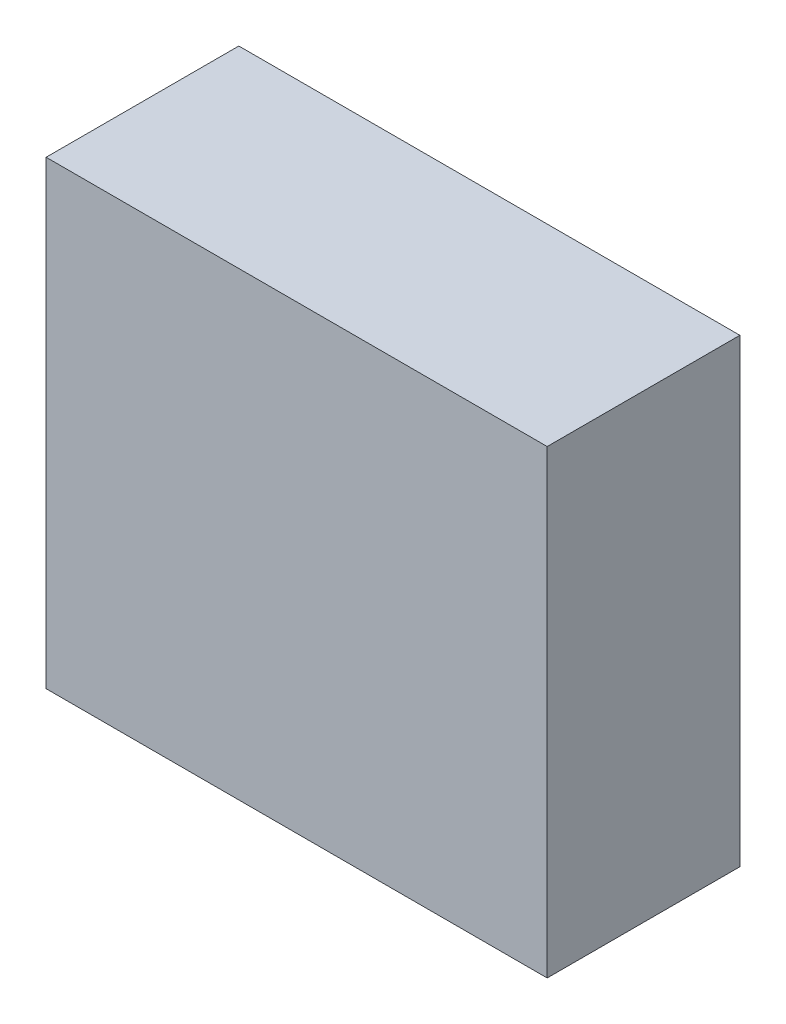
ISO-10303-21;
HEADER;
FILE_DESCRIPTION(('STEP AP214'),'2;1');
FILE_NAME('part.step','',(''),(''),'','','');
FILE_SCHEMA(('AUTOMOTIVE_DESIGN { 1 0 10303 214 1 1 1 1 }'));
ENDSEC;
DATA;
#1=APPLICATION_CONTEXT('core data for automotive mechanical design processes');
#2=APPLICATION_PROTOCOL_DEFINITION('international standard','automotive_design',2000,#1);
#3=PRODUCT_CONTEXT('',#1,'mechanical');
#4=PRODUCT('Part','Part','',(#3));
#5=PRODUCT_RELATED_PRODUCT_CATEGORY('part','',(#4));
#6=PRODUCT_DEFINITION_FORMATION('','',#4);
#7=PRODUCT_DEFINITION_CONTEXT('part definition',#1,'design');
#8=PRODUCT_DEFINITION('design','',#6,#7);
#9=PRODUCT_DEFINITION_SHAPE('','',#8);
#10=(LENGTH_UNIT() NAMED_UNIT(*) SI_UNIT(.MILLI.,.METRE.));
#11=(NAMED_UNIT(*) PLANE_ANGLE_UNIT() SI_UNIT($,.RADIAN.));
#12=(NAMED_UNIT(*) SI_UNIT($,.STERADIAN.) SOLID_ANGLE_UNIT());
#13=UNCERTAINTY_MEASURE_WITH_UNIT(LENGTH_MEASURE(1.E-05),#10,'distance_accuracy_value','');
#14=(GEOMETRIC_REPRESENTATION_CONTEXT(3) GLOBAL_UNCERTAINTY_ASSIGNED_CONTEXT((#13)) GLOBAL_UNIT_ASSIGNED_CONTEXT((#10,
#11,#12)) REPRESENTATION_CONTEXT('',''));
#15=CARTESIAN_POINT('',(0.,0.,0.));
#16=DIRECTION('',(0.,0.,1.));
#17=DIRECTION('',(1.,0.,0.));
#18=AXIS2_PLACEMENT_3D('',#15,#16,#17);
#19=CARTESIAN_POINT('',(1.0922,-1.0033,0.84000086));
#20=DIRECTION('',(0.,0.,1.));
#21=DIRECTION('',(1.,0.,0.));
#22=AXIS2_PLACEMENT_3D('',#19,#20,#21);
#23=PLANE('',#22);
#24=DIRECTION('',(0.,-1.,0.));
#25=VECTOR('',#24,1.);
#26=CARTESIAN_POINT('',(1.0922,1.0033,0.84000086));
#27=LINE('',#26,#25);
#28=CARTESIAN_POINT('',(1.0922,1.0033,0.84000086));
#29=VERTEX_POINT('',#28);
#30=CARTESIAN_POINT('',(1.0922,-1.0033,0.84000086));
#31=VERTEX_POINT('',#30);
#32=EDGE_CURVE('E26',#29,#31,#27,.T.);
#33=ORIENTED_EDGE('',*,*,#32,.F.);
#34=DIRECTION('',(1.,0.,0.));
#35=VECTOR('',#34,1.);
#36=CARTESIAN_POINT('',(-1.0922,1.0033,0.84000086));
#37=LINE('',#36,#35);
#38=CARTESIAN_POINT('',(-1.0922,1.0033,0.84000086));
#39=VERTEX_POINT('',#38);
#40=EDGE_CURVE('E63',#39,#29,#37,.T.);
#41=ORIENTED_EDGE('',*,*,#40,.F.);
#42=DIRECTION('',(0.,1.,0.));
#43=VECTOR('',#42,1.);
#44=CARTESIAN_POINT('',(-1.0922,-1.0033,0.84000086));
#45=LINE('',#44,#43);
#46=CARTESIAN_POINT('',(-1.0922,-1.0033,0.84000086));
#47=VERTEX_POINT('',#46);
#48=EDGE_CURVE('E91',#47,#39,#45,.T.);
#49=ORIENTED_EDGE('',*,*,#48,.F.);
#50=DIRECTION('',(-1.,0.,0.));
#51=VECTOR('',#50,1.);
#52=CARTESIAN_POINT('',(1.0922,-1.0033,0.84000086));
#53=LINE('',#52,#51);
#54=EDGE_CURVE('E109',#31,#47,#53,.T.);
#55=ORIENTED_EDGE('',*,*,#54,.F.);
#56=EDGE_LOOP('',(#33,#41,#49,#55));
#57=FACE_BOUND('',#56,.T.);
#58=ADVANCED_FACE('F17',(#57),#23,.T.);
#59=CARTESIAN_POINT('',(1.0922,-1.0033,0.));
#60=DIRECTION('',(0.,0.,1.));
#61=DIRECTION('',(1.,0.,0.));
#62=AXIS2_PLACEMENT_3D('',#59,#60,#61);
#63=PLANE('',#62);
#64=DIRECTION('',(-1.,0.,0.));
#65=VECTOR('',#64,1.);
#66=CARTESIAN_POINT('',(1.0922,-1.0033,0.));
#67=LINE('',#66,#65);
#68=CARTESIAN_POINT('',(1.0922,-1.0033,0.));
#69=VERTEX_POINT('',#68);
#70=CARTESIAN_POINT('',(-1.0922,-1.0033,0.));
#71=VERTEX_POINT('',#70);
#72=EDGE_CURVE('E84',#69,#71,#67,.T.);
#73=ORIENTED_EDGE('',*,*,#72,.T.);
#74=DIRECTION('',(0.,1.,0.));
#75=VECTOR('',#74,1.);
#76=CARTESIAN_POINT('',(-1.0922,-1.0033,0.));
#77=LINE('',#76,#75);
#78=CARTESIAN_POINT('',(-1.0922,1.0033,0.));
#79=VERTEX_POINT('',#78);
#80=EDGE_CURVE('E81',#71,#79,#77,.T.);
#81=ORIENTED_EDGE('',*,*,#80,.T.);
#82=DIRECTION('',(1.,0.,0.));
#83=VECTOR('',#82,1.);
#84=CARTESIAN_POINT('',(-1.0922,1.0033,0.));
#85=LINE('',#84,#83);
#86=CARTESIAN_POINT('',(1.0922,1.0033,0.));
#87=VERTEX_POINT('',#86);
#88=EDGE_CURVE('E70',#79,#87,#85,.T.);
#89=ORIENTED_EDGE('',*,*,#88,.T.);
#90=DIRECTION('',(0.,-1.,0.));
#91=VECTOR('',#90,1.);
#92=CARTESIAN_POINT('',(1.0922,1.0033,0.));
#93=LINE('',#92,#91);
#94=EDGE_CURVE('E11',#87,#69,#93,.T.);
#95=ORIENTED_EDGE('',*,*,#94,.T.);
#96=EDGE_LOOP('',(#73,#81,#89,#95));
#97=FACE_BOUND('',#96,.T.);
#98=ADVANCED_FACE('F82',(#97),#63,.F.);
#99=CARTESIAN_POINT('',(1.0922,1.0033,0.));
#100=DIRECTION('',(1.,0.,0.));
#101=DIRECTION('',(0.,1.,0.));
#102=AXIS2_PLACEMENT_3D('',#99,#100,#101);
#103=PLANE('',#102);
#104=DIRECTION('',(0.,0.,1.));
#105=VECTOR('',#104,1.);
#106=CARTESIAN_POINT('',(1.0922,1.0033,0.));
#107=LINE('',#106,#105);
#108=EDGE_CURVE('E76',#87,#29,#107,.T.);
#109=ORIENTED_EDGE('',*,*,#108,.T.);
#110=ORIENTED_EDGE('',*,*,#32,.T.);
#111=DIRECTION('',(0.,0.,1.));
#112=VECTOR('',#111,1.);
#113=CARTESIAN_POINT('',(1.0922,-1.0033,0.));
#114=LINE('',#113,#112);
#115=EDGE_CURVE('E107',#69,#31,#114,.T.);
#116=ORIENTED_EDGE('',*,*,#115,.F.);
#117=ORIENTED_EDGE('',*,*,#94,.F.);
#118=EDGE_LOOP('',(#109,#110,#116,#117));
#119=FACE_BOUND('',#118,.T.);
#120=ADVANCED_FACE('F105',(#119),#103,.T.);
#121=CARTESIAN_POINT('',(-1.0922,1.0033,0.));
#122=DIRECTION('',(0.,1.,0.));
#123=DIRECTION('',(1.,0.,0.));
#124=AXIS2_PLACEMENT_3D('',#121,#122,#123);
#125=PLANE('',#124);
#126=DIRECTION('',(0.,0.,1.));
#127=VECTOR('',#126,1.);
#128=CARTESIAN_POINT('',(-1.0922,1.0033,0.));
#129=LINE('',#128,#127);
#130=EDGE_CURVE('E74',#79,#39,#129,.T.);
#131=ORIENTED_EDGE('',*,*,#130,.T.);
#132=ORIENTED_EDGE('',*,*,#40,.T.);
#133=ORIENTED_EDGE('',*,*,#108,.F.);
#134=ORIENTED_EDGE('',*,*,#88,.F.);
#135=EDGE_LOOP('',(#131,#132,#133,#134));
#136=FACE_BOUND('',#135,.T.);
#137=ADVANCED_FACE('F72',(#136),#125,.T.);
#138=CARTESIAN_POINT('',(-1.0922,-1.0033,0.));
#139=DIRECTION('',(-1.,0.,0.));
#140=DIRECTION('',(0.,0.,1.));
#141=AXIS2_PLACEMENT_3D('',#138,#139,#140);
#142=PLANE('',#141);
#143=DIRECTION('',(0.,0.,1.));
#144=VECTOR('',#143,1.);
#145=CARTESIAN_POINT('',(-1.0922,-1.0033,0.));
#146=LINE('',#145,#144);
#147=EDGE_CURVE('E112',#71,#47,#146,.T.);
#148=ORIENTED_EDGE('',*,*,#147,.T.);
#149=ORIENTED_EDGE('',*,*,#48,.T.);
#150=ORIENTED_EDGE('',*,*,#130,.F.);
#151=ORIENTED_EDGE('',*,*,#80,.F.);
#152=EDGE_LOOP('',(#148,#149,#150,#151));
#153=FACE_BOUND('',#152,.T.);
#154=ADVANCED_FACE('F90',(#153),#142,.T.);
#155=CARTESIAN_POINT('',(1.0922,-1.0033,0.));
#156=DIRECTION('',(0.,-1.,0.));
#157=DIRECTION('',(0.,0.,-1.));
#158=AXIS2_PLACEMENT_3D('',#155,#156,#157);
#159=PLANE('',#158);
#160=ORIENTED_EDGE('',*,*,#115,.T.);
#161=ORIENTED_EDGE('',*,*,#54,.T.);
#162=ORIENTED_EDGE('',*,*,#147,.F.);
#163=ORIENTED_EDGE('',*,*,#72,.F.);
#164=EDGE_LOOP('',(#160,#161,#162,#163));
#165=FACE_BOUND('',#164,.T.);
#166=ADVANCED_FACE('F114',(#165),#159,.T.);
#167=CLOSED_SHELL('',(#58,#98,#120,#137,#154,#166));
#168=MANIFOLD_SOLID_BREP('B1',#167);
#169=ADVANCED_BREP_SHAPE_REPRESENTATION('',(#18,#168),#14);
#170=SHAPE_DEFINITION_REPRESENTATION(#9,#169);
ENDSEC;
END-ISO-10303-21;
